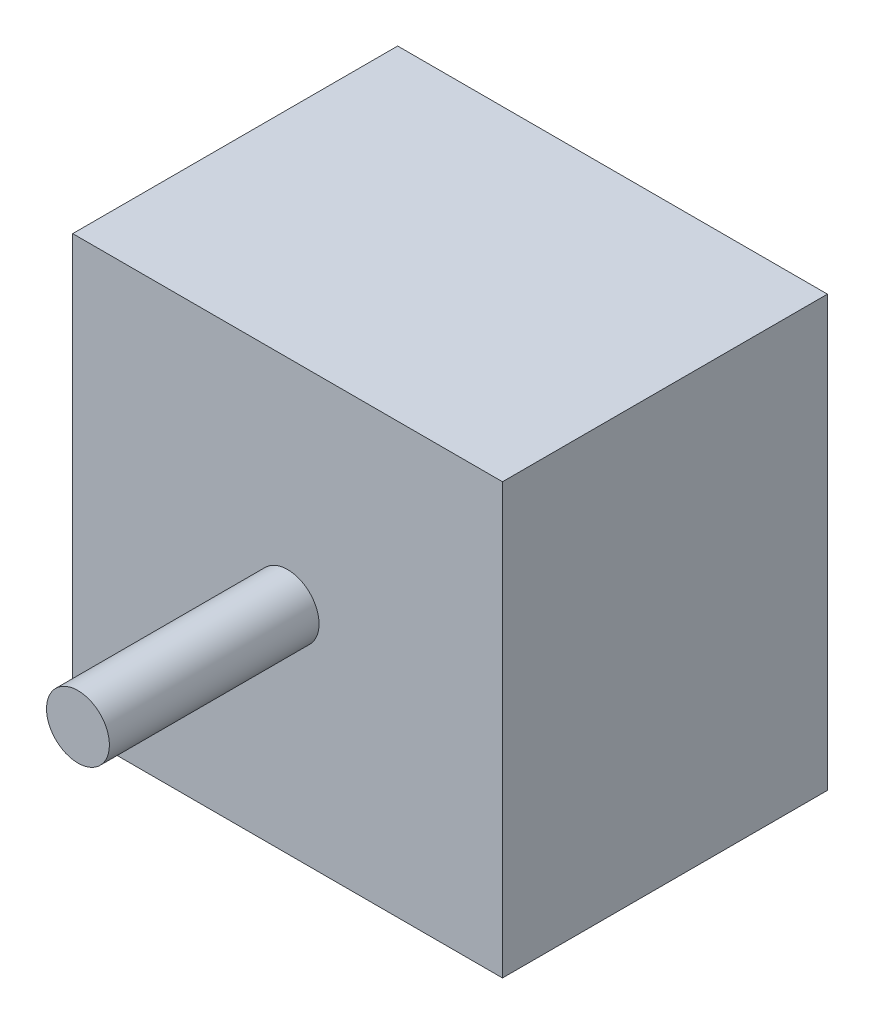
ISO-10303-21;
HEADER;
FILE_DESCRIPTION(('STEP AP214'),'2;1');
FILE_NAME('part.step','',(''),(''),'','','');
FILE_SCHEMA(('AUTOMOTIVE_DESIGN { 1 0 10303 214 1 1 1 1 }'));
ENDSEC;
DATA;
#1=APPLICATION_CONTEXT('core data for automotive mechanical design processes');
#2=APPLICATION_PROTOCOL_DEFINITION('international standard','automotive_design',2000,#1);
#3=PRODUCT_CONTEXT('',#1,'mechanical');
#4=PRODUCT('Part','Part','',(#3));
#5=PRODUCT_RELATED_PRODUCT_CATEGORY('part','',(#4));
#6=PRODUCT_DEFINITION_FORMATION('','',#4);
#7=PRODUCT_DEFINITION_CONTEXT('part definition',#1,'design');
#8=PRODUCT_DEFINITION('design','',#6,#7);
#9=PRODUCT_DEFINITION_SHAPE('','',#8);
#10=(LENGTH_UNIT() NAMED_UNIT(*) SI_UNIT(.MILLI.,.METRE.));
#11=(NAMED_UNIT(*) PLANE_ANGLE_UNIT() SI_UNIT($,.RADIAN.));
#12=(NAMED_UNIT(*) SI_UNIT($,.STERADIAN.) SOLID_ANGLE_UNIT());
#13=UNCERTAINTY_MEASURE_WITH_UNIT(LENGTH_MEASURE(1.E-05),#10,'distance_accuracy_value','');
#14=(GEOMETRIC_REPRESENTATION_CONTEXT(3) GLOBAL_UNCERTAINTY_ASSIGNED_CONTEXT((#13)) GLOBAL_UNIT_ASSIGNED_CONTEXT((#10,
#11,#12)) REPRESENTATION_CONTEXT('',''));
#15=CARTESIAN_POINT('',(0.,0.,0.));
#16=DIRECTION('',(0.,0.,1.));
#17=DIRECTION('',(1.,0.,0.));
#18=AXIS2_PLACEMENT_3D('',#15,#16,#17);
#19=CARTESIAN_POINT('',(0.,0.,31.));
#20=DIRECTION('',(0.,0.,1.));
#21=DIRECTION('',(1.,0.,0.));
#22=AXIS2_PLACEMENT_3D('',#19,#20,#21);
#23=PLANE('',#22);
#24=DIRECTION('',(0.,-1.,0.));
#25=VECTOR('',#24,1.);
#26=CARTESIAN_POINT('',(-20.5,-20.5,31.));
#27=LINE('',#26,#25);
#28=CARTESIAN_POINT('',(-20.5,20.5,31.));
#29=VERTEX_POINT('',#28);
#30=CARTESIAN_POINT('',(-20.5,-20.5,31.));
#31=VERTEX_POINT('',#30);
#32=EDGE_CURVE('E85',#29,#31,#27,.T.);
#33=ORIENTED_EDGE('',*,*,#32,.T.);
#34=DIRECTION('',(1.,0.,0.));
#35=VECTOR('',#34,1.);
#36=CARTESIAN_POINT('',(20.5,-20.5,31.));
#37=LINE('',#36,#35);
#38=CARTESIAN_POINT('',(20.5,-20.5,31.));
#39=VERTEX_POINT('',#38);
#40=EDGE_CURVE('E80',#31,#39,#37,.T.);
#41=ORIENTED_EDGE('',*,*,#40,.T.);
#42=DIRECTION('',(0.,1.,0.));
#43=VECTOR('',#42,1.);
#44=CARTESIAN_POINT('',(20.5,-20.5,31.));
#45=LINE('',#44,#43);
#46=CARTESIAN_POINT('',(20.5,20.5,31.));
#47=VERTEX_POINT('',#46);
#48=EDGE_CURVE('E83',#39,#47,#45,.T.);
#49=ORIENTED_EDGE('',*,*,#48,.T.);
#50=DIRECTION('',(-1.,0.,0.));
#51=VECTOR('',#50,1.);
#52=CARTESIAN_POINT('',(20.5,20.5,31.));
#53=LINE('',#52,#51);
#54=EDGE_CURVE('E50',#47,#29,#53,.T.);
#55=ORIENTED_EDGE('',*,*,#54,.T.);
#56=EDGE_LOOP('',(#33,#41,#49,#55));
#57=FACE_BOUND('',#56,.T.);
#58=CARTESIAN_POINT('',(0.,0.,31.));
#59=DIRECTION('',(0.,0.,1.));
#60=DIRECTION('',(1.,0.,0.));
#61=AXIS2_PLACEMENT_3D('',#58,#59,#60);
#62=CIRCLE('',#61,3.);
#63=CARTESIAN_POINT('',(3.,0.,31.));
#64=VERTEX_POINT('',#63);
#65=EDGE_CURVE('E100',#64,#64,#62,.T.);
#66=ORIENTED_EDGE('',*,*,#65,.F.);
#67=EDGE_LOOP('',(#66));
#68=FACE_BOUND('',#67,.T.);
#69=ADVANCED_FACE('F33',(#57,#68),#23,.T.);
#70=CARTESIAN_POINT('',(0.,0.,0.));
#71=DIRECTION('',(0.,0.,1.));
#72=DIRECTION('',(1.,0.,0.));
#73=AXIS2_PLACEMENT_3D('',#70,#71,#72);
#74=PLANE('',#73);
#75=DIRECTION('',(0.,-1.,0.));
#76=VECTOR('',#75,1.);
#77=CARTESIAN_POINT('',(-20.5,-20.5,0.));
#78=LINE('',#77,#76);
#79=CARTESIAN_POINT('',(-20.5,20.5,0.));
#80=VERTEX_POINT('',#79);
#81=CARTESIAN_POINT('',(-20.5,-20.5,0.));
#82=VERTEX_POINT('',#81);
#83=EDGE_CURVE('E97',#80,#82,#78,.T.);
#84=ORIENTED_EDGE('',*,*,#83,.F.);
#85=DIRECTION('',(-1.,0.,0.));
#86=VECTOR('',#85,1.);
#87=CARTESIAN_POINT('',(20.5,20.5,0.));
#88=LINE('',#87,#86);
#89=CARTESIAN_POINT('',(20.5,20.5,0.));
#90=VERTEX_POINT('',#89);
#91=EDGE_CURVE('E73',#90,#80,#88,.T.);
#92=ORIENTED_EDGE('',*,*,#91,.F.);
#93=DIRECTION('',(0.,1.,0.));
#94=VECTOR('',#93,1.);
#95=CARTESIAN_POINT('',(20.5,-20.5,0.));
#96=LINE('',#95,#94);
#97=CARTESIAN_POINT('',(20.5,-20.5,0.));
#98=VERTEX_POINT('',#97);
#99=EDGE_CURVE('E67',#98,#90,#96,.T.);
#100=ORIENTED_EDGE('',*,*,#99,.F.);
#101=DIRECTION('',(1.,0.,0.));
#102=VECTOR('',#101,1.);
#103=CARTESIAN_POINT('',(20.5,-20.5,0.));
#104=LINE('',#103,#102);
#105=EDGE_CURVE('E89',#82,#98,#104,.T.);
#106=ORIENTED_EDGE('',*,*,#105,.F.);
#107=EDGE_LOOP('',(#84,#92,#100,#106));
#108=FACE_BOUND('',#107,.T.);
#109=ADVANCED_FACE('F108',(#108),#74,.F.);
#110=CARTESIAN_POINT('',(-20.5,-20.5,31.));
#111=DIRECTION('',(1.,0.,0.));
#112=DIRECTION('',(0.,0.,-1.));
#113=AXIS2_PLACEMENT_3D('',#110,#111,#112);
#114=PLANE('',#113);
#115=ORIENTED_EDGE('',*,*,#83,.T.);
#116=DIRECTION('',(0.,0.,-1.));
#117=VECTOR('',#116,1.);
#118=CARTESIAN_POINT('',(-20.5,-20.5,31.));
#119=LINE('',#118,#117);
#120=EDGE_CURVE('E11',#31,#82,#119,.T.);
#121=ORIENTED_EDGE('',*,*,#120,.F.);
#122=ORIENTED_EDGE('',*,*,#32,.F.);
#123=DIRECTION('',(0.,0.,-1.));
#124=VECTOR('',#123,1.);
#125=CARTESIAN_POINT('',(-20.5,20.5,31.));
#126=LINE('',#125,#124);
#127=EDGE_CURVE('E93',#29,#80,#126,.T.);
#128=ORIENTED_EDGE('',*,*,#127,.T.);
#129=EDGE_LOOP('',(#115,#121,#122,#128));
#130=FACE_BOUND('',#129,.T.);
#131=ADVANCED_FACE('F35',(#130),#114,.F.);
#132=CARTESIAN_POINT('',(20.5,-20.5,31.));
#133=DIRECTION('',(0.,1.,0.));
#134=DIRECTION('',(-1.,0.,0.));
#135=AXIS2_PLACEMENT_3D('',#132,#133,#134);
#136=PLANE('',#135);
#137=ORIENTED_EDGE('',*,*,#105,.T.);
#138=DIRECTION('',(0.,0.,-1.));
#139=VECTOR('',#138,1.);
#140=CARTESIAN_POINT('',(20.5,-20.5,31.));
#141=LINE('',#140,#139);
#142=EDGE_CURVE('E42',#39,#98,#141,.T.);
#143=ORIENTED_EDGE('',*,*,#142,.F.);
#144=ORIENTED_EDGE('',*,*,#40,.F.);
#145=ORIENTED_EDGE('',*,*,#120,.T.);
#146=EDGE_LOOP('',(#137,#143,#144,#145));
#147=FACE_BOUND('',#146,.T.);
#148=ADVANCED_FACE('F88',(#147),#136,.F.);
#149=CARTESIAN_POINT('',(20.5,-20.5,31.));
#150=DIRECTION('',(-1.,0.,0.));
#151=DIRECTION('',(0.,0.,1.));
#152=AXIS2_PLACEMENT_3D('',#149,#150,#151);
#153=PLANE('',#152);
#154=ORIENTED_EDGE('',*,*,#99,.T.);
#155=DIRECTION('',(0.,0.,-1.));
#156=VECTOR('',#155,1.);
#157=CARTESIAN_POINT('',(20.5,20.5,31.));
#158=LINE('',#157,#156);
#159=EDGE_CURVE('E90',#47,#90,#158,.T.);
#160=ORIENTED_EDGE('',*,*,#159,.F.);
#161=ORIENTED_EDGE('',*,*,#48,.F.);
#162=ORIENTED_EDGE('',*,*,#142,.T.);
#163=EDGE_LOOP('',(#154,#160,#161,#162));
#164=FACE_BOUND('',#163,.T.);
#165=ADVANCED_FACE('F91',(#164),#153,.F.);
#166=CARTESIAN_POINT('',(20.5,20.5,31.));
#167=DIRECTION('',(0.,-1.,0.));
#168=DIRECTION('',(1.,0.,0.));
#169=AXIS2_PLACEMENT_3D('',#166,#167,#168);
#170=PLANE('',#169);
#171=ORIENTED_EDGE('',*,*,#91,.T.);
#172=ORIENTED_EDGE('',*,*,#127,.F.);
#173=ORIENTED_EDGE('',*,*,#54,.F.);
#174=ORIENTED_EDGE('',*,*,#159,.T.);
#175=EDGE_LOOP('',(#171,#172,#173,#174));
#176=FACE_BOUND('',#175,.T.);
#177=ADVANCED_FACE('F105',(#176),#170,.F.);
#178=CARTESIAN_POINT('',(0.,0.,51.));
#179=DIRECTION('',(0.,0.,-1.));
#180=DIRECTION('',(-1.,0.,0.));
#181=AXIS2_PLACEMENT_3D('',#178,#179,#180);
#182=CYLINDRICAL_SURFACE('',#181,3.);
#183=ORIENTED_EDGE('',*,*,#65,.T.);
#184=EDGE_LOOP('',(#183));
#185=FACE_BOUND('',#184,.T.);
#186=CARTESIAN_POINT('',(0.,0.,51.));
#187=DIRECTION('',(0.,0.,1.));
#188=DIRECTION('',(1.,0.,0.));
#189=AXIS2_PLACEMENT_3D('',#186,#187,#188);
#190=CIRCLE('',#189,3.);
#191=CARTESIAN_POINT('',(3.,0.,51.));
#192=VERTEX_POINT('',#191);
#193=EDGE_CURVE('E113',#192,#192,#190,.T.);
#194=ORIENTED_EDGE('',*,*,#193,.F.);
#195=EDGE_LOOP('',(#194));
#196=FACE_BOUND('',#195,.T.);
#197=ADVANCED_FACE('F119',(#185,#196),#182,.T.);
#198=CARTESIAN_POINT('',(0.,0.,51.));
#199=DIRECTION('',(0.,0.,1.));
#200=DIRECTION('',(1.,0.,0.));
#201=AXIS2_PLACEMENT_3D('',#198,#199,#200);
#202=PLANE('',#201);
#203=ORIENTED_EDGE('',*,*,#193,.T.);
#204=EDGE_LOOP('',(#203));
#205=FACE_BOUND('',#204,.T.);
#206=ADVANCED_FACE('F117',(#205),#202,.T.);
#207=CLOSED_SHELL('',(#69,#109,#131,#148,#165,#177,#197,#206));
#208=MANIFOLD_SOLID_BREP('B2',#207);
#209=ADVANCED_BREP_SHAPE_REPRESENTATION('',(#18,#208),#14);
#210=SHAPE_DEFINITION_REPRESENTATION(#9,#209);
ENDSEC;
END-ISO-10303-21;
